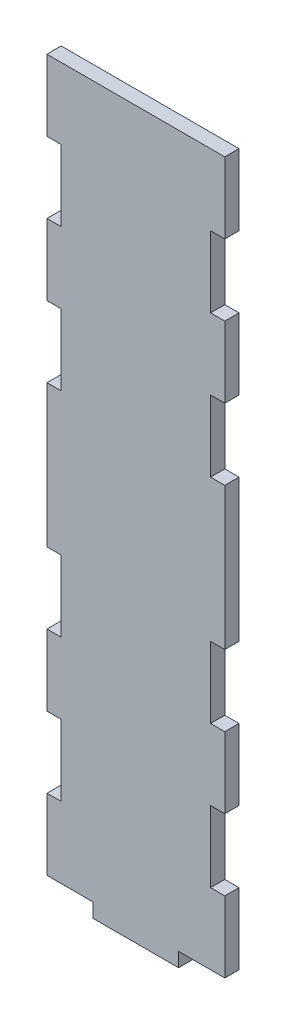
ISO-10303-21;
HEADER;
FILE_DESCRIPTION(('STEP AP214'),'2;1');
FILE_NAME('part.step','',(''),(''),'','','');
FILE_SCHEMA(('AUTOMOTIVE_DESIGN { 1 0 10303 214 1 1 1 1 }'));
ENDSEC;
DATA;
#1=APPLICATION_CONTEXT('core data for automotive mechanical design processes');
#2=APPLICATION_PROTOCOL_DEFINITION('international standard','automotive_design',2000,#1);
#3=PRODUCT_CONTEXT('',#1,'mechanical');
#4=PRODUCT('Part','Part','',(#3));
#5=PRODUCT_RELATED_PRODUCT_CATEGORY('part','',(#4));
#6=PRODUCT_DEFINITION_FORMATION('','',#4);
#7=PRODUCT_DEFINITION_CONTEXT('part definition',#1,'design');
#8=PRODUCT_DEFINITION('design','',#6,#7);
#9=PRODUCT_DEFINITION_SHAPE('','',#8);
#10=(LENGTH_UNIT() NAMED_UNIT(*) SI_UNIT(.MILLI.,.METRE.));
#11=(NAMED_UNIT(*) PLANE_ANGLE_UNIT() SI_UNIT($,.RADIAN.));
#12=(NAMED_UNIT(*) SI_UNIT($,.STERADIAN.) SOLID_ANGLE_UNIT());
#13=UNCERTAINTY_MEASURE_WITH_UNIT(LENGTH_MEASURE(1.E-05),#10,'distance_accuracy_value','');
#14=(GEOMETRIC_REPRESENTATION_CONTEXT(3) GLOBAL_UNCERTAINTY_ASSIGNED_CONTEXT((#13)) GLOBAL_UNIT_ASSIGNED_CONTEXT((#10,
#11,#12)) REPRESENTATION_CONTEXT('',''));
#15=CARTESIAN_POINT('',(0.,0.,0.));
#16=DIRECTION('',(0.,0.,1.));
#17=DIRECTION('',(1.,0.,0.));
#18=AXIS2_PLACEMENT_3D('',#15,#16,#17);
#19=CARTESIAN_POINT('',(50.,-100.,4.));
#20=DIRECTION('',(-1.,0.,0.));
#21=DIRECTION('',(0.,0.,1.));
#22=AXIS2_PLACEMENT_3D('',#19,#20,#21);
#23=PLANE('',#22);
#24=DIRECTION('',(0.,1.,0.));
#25=VECTOR('',#24,1.);
#26=CARTESIAN_POINT('',(50.,-100.,0.));
#27=LINE('',#26,#25);
#28=CARTESIAN_POINT('',(50.,40.,0.));
#29=VERTEX_POINT('',#28);
#30=CARTESIAN_POINT('',(50.,60.,0.));
#31=VERTEX_POINT('',#30);
#32=EDGE_CURVE('E391',#29,#31,#27,.T.);
#33=ORIENTED_EDGE('',*,*,#32,.T.);
#34=DIRECTION('',(0.,0.,1.));
#35=VECTOR('',#34,1.);
#36=CARTESIAN_POINT('',(50.,60.,0.));
#37=LINE('',#36,#35);
#38=CARTESIAN_POINT('',(50.,60.,4.));
#39=VERTEX_POINT('',#38);
#40=EDGE_CURVE('E584',#31,#39,#37,.T.);
#41=ORIENTED_EDGE('',*,*,#40,.T.);
#42=DIRECTION('',(0.,1.,0.));
#43=VECTOR('',#42,1.);
#44=CARTESIAN_POINT('',(50.,-100.,4.));
#45=LINE('',#44,#43);
#46=CARTESIAN_POINT('',(50.,40.,4.));
#47=VERTEX_POINT('',#46);
#48=EDGE_CURVE('E647',#47,#39,#45,.T.);
#49=ORIENTED_EDGE('',*,*,#48,.F.);
#50=DIRECTION('',(0.,0.,1.));
#51=VECTOR('',#50,1.);
#52=CARTESIAN_POINT('',(50.,40.,0.));
#53=LINE('',#52,#51);
#54=EDGE_CURVE('E432',#29,#47,#53,.T.);
#55=ORIENTED_EDGE('',*,*,#54,.F.);
#56=EDGE_LOOP('',(#33,#41,#49,#55));
#57=FACE_BOUND('',#56,.T.);
#58=ADVANCED_FACE('F111',(#57),#23,.F.);
#59=CARTESIAN_POINT('',(50.,-20.,4.));
#60=VERTEX_POINT('',#59);
#61=CARTESIAN_POINT('',(50.,20.,4.));
#62=VERTEX_POINT('',#61);
#63=EDGE_CURVE('E650',#60,#62,#45,.T.);
#64=ORIENTED_EDGE('',*,*,#63,.F.);
#65=DIRECTION('',(0.,0.,1.));
#66=VECTOR('',#65,1.);
#67=CARTESIAN_POINT('',(50.,-20.,0.));
#68=LINE('',#67,#66);
#69=CARTESIAN_POINT('',(50.,-20.,0.));
#70=VERTEX_POINT('',#69);
#71=EDGE_CURVE('E423',#70,#60,#68,.T.);
#72=ORIENTED_EDGE('',*,*,#71,.F.);
#73=CARTESIAN_POINT('',(50.,20.,0.));
#74=VERTEX_POINT('',#73);
#75=EDGE_CURVE('E396',#70,#74,#27,.T.);
#76=ORIENTED_EDGE('',*,*,#75,.T.);
#77=DIRECTION('',(0.,0.,1.));
#78=VECTOR('',#77,1.);
#79=CARTESIAN_POINT('',(50.,20.,0.));
#80=LINE('',#79,#78);
#81=EDGE_CURVE('E421',#74,#62,#80,.T.);
#82=ORIENTED_EDGE('',*,*,#81,.T.);
#83=EDGE_LOOP('',(#64,#72,#76,#82));
#84=FACE_BOUND('',#83,.T.);
#85=ADVANCED_FACE('F420',(#84),#23,.F.);
#86=CARTESIAN_POINT('',(50.,-60.,0.));
#87=VERTEX_POINT('',#86);
#88=CARTESIAN_POINT('',(50.,-40.,0.));
#89=VERTEX_POINT('',#88);
#90=EDGE_CURVE('E403',#87,#89,#27,.T.);
#91=ORIENTED_EDGE('',*,*,#90,.T.);
#92=DIRECTION('',(0.,0.,1.));
#93=VECTOR('',#92,1.);
#94=CARTESIAN_POINT('',(50.,-40.,0.));
#95=LINE('',#94,#93);
#96=CARTESIAN_POINT('',(50.,-40.,4.));
#97=VERTEX_POINT('',#96);
#98=EDGE_CURVE('E665',#89,#97,#95,.T.);
#99=ORIENTED_EDGE('',*,*,#98,.T.);
#100=CARTESIAN_POINT('',(50.,-60.,4.));
#101=VERTEX_POINT('',#100);
#102=EDGE_CURVE('E596',#101,#97,#45,.T.);
#103=ORIENTED_EDGE('',*,*,#102,.F.);
#104=DIRECTION('',(0.,0.,1.));
#105=VECTOR('',#104,1.);
#106=CARTESIAN_POINT('',(50.,-60.,0.));
#107=LINE('',#106,#105);
#108=EDGE_CURVE('E449',#87,#101,#107,.T.);
#109=ORIENTED_EDGE('',*,*,#108,.F.);
#110=EDGE_LOOP('',(#91,#99,#103,#109));
#111=FACE_BOUND('',#110,.T.);
#112=ADVANCED_FACE('F664',(#111),#23,.F.);
#113=CARTESIAN_POINT('',(50.,-100.,0.));
#114=VERTEX_POINT('',#113);
#115=CARTESIAN_POINT('',(50.,-80.,0.));
#116=VERTEX_POINT('',#115);
#117=EDGE_CURVE('E394',#114,#116,#27,.T.);
#118=ORIENTED_EDGE('',*,*,#117,.T.);
#119=DIRECTION('',(0.,0.,1.));
#120=VECTOR('',#119,1.);
#121=CARTESIAN_POINT('',(50.,-80.,0.));
#122=LINE('',#121,#120);
#123=CARTESIAN_POINT('',(50.,-80.,4.));
#124=VERTEX_POINT('',#123);
#125=EDGE_CURVE('E447',#116,#124,#122,.T.);
#126=ORIENTED_EDGE('',*,*,#125,.T.);
#127=CARTESIAN_POINT('',(50.,-100.,4.));
#128=VERTEX_POINT('',#127);
#129=EDGE_CURVE('E592',#128,#124,#45,.T.);
#130=ORIENTED_EDGE('',*,*,#129,.F.);
#131=DIRECTION('',(0.,0.,-1.));
#132=VECTOR('',#131,1.);
#133=CARTESIAN_POINT('',(50.,-100.,4.));
#134=LINE('',#133,#132);
#135=EDGE_CURVE('E607',#128,#114,#134,.T.);
#136=ORIENTED_EDGE('',*,*,#135,.T.);
#137=EDGE_LOOP('',(#118,#126,#130,#136));
#138=FACE_BOUND('',#137,.T.);
#139=ADVANCED_FACE('F738',(#138),#23,.F.);
#140=CARTESIAN_POINT('',(50.,80.,4.));
#141=VERTEX_POINT('',#140);
#142=CARTESIAN_POINT('',(50.,100.,4.));
#143=VERTEX_POINT('',#142);
#144=EDGE_CURVE('E383',#141,#143,#45,.T.);
#145=ORIENTED_EDGE('',*,*,#144,.F.);
#146=DIRECTION('',(0.,0.,1.));
#147=VECTOR('',#146,1.);
#148=CARTESIAN_POINT('',(50.,80.,0.));
#149=LINE('',#148,#147);
#150=CARTESIAN_POINT('',(50.,80.,0.));
#151=VERTEX_POINT('',#150);
#152=EDGE_CURVE('E371',#151,#141,#149,.T.);
#153=ORIENTED_EDGE('',*,*,#152,.F.);
#154=CARTESIAN_POINT('',(50.,100.,0.));
#155=VERTEX_POINT('',#154);
#156=EDGE_CURVE('E381',#151,#155,#27,.T.);
#157=ORIENTED_EDGE('',*,*,#156,.T.);
#158=DIRECTION('',(0.,0.,-1.));
#159=VECTOR('',#158,1.);
#160=CARTESIAN_POINT('',(50.,100.,4.));
#161=LINE('',#160,#159);
#162=EDGE_CURVE('E12',#143,#155,#161,.T.);
#163=ORIENTED_EDGE('',*,*,#162,.F.);
#164=EDGE_LOOP('',(#145,#153,#157,#163));
#165=FACE_BOUND('',#164,.T.);
#166=ADVANCED_FACE('F113',(#165),#23,.F.);
#167=CARTESIAN_POINT('',(-50.,100.,4.));
#168=DIRECTION('',(0.,-1.,0.));
#169=DIRECTION('',(1.,0.,0.));
#170=AXIS2_PLACEMENT_3D('',#167,#168,#169);
#171=PLANE('',#170);
#172=DIRECTION('',(-1.,0.,0.));
#173=VECTOR('',#172,1.);
#174=CARTESIAN_POINT('',(-50.,100.,0.));
#175=LINE('',#174,#173);
#176=CARTESIAN_POINT('',(0.,100.,0.));
#177=VERTEX_POINT('',#176);
#178=EDGE_CURVE('E390',#155,#177,#175,.T.);
#179=ORIENTED_EDGE('',*,*,#178,.T.);
#180=DIRECTION('',(0.,0.,1.));
#181=VECTOR('',#180,1.);
#182=CARTESIAN_POINT('',(0.,100.,0.));
#183=LINE('',#182,#181);
#184=CARTESIAN_POINT('',(0.,100.,4.));
#185=VERTEX_POINT('',#184);
#186=EDGE_CURVE('E540',#177,#185,#183,.T.);
#187=ORIENTED_EDGE('',*,*,#186,.T.);
#188=DIRECTION('',(-1.,0.,0.));
#189=VECTOR('',#188,1.);
#190=CARTESIAN_POINT('',(-50.,100.,4.));
#191=LINE('',#190,#189);
#192=EDGE_CURVE('E595',#143,#185,#191,.T.);
#193=ORIENTED_EDGE('',*,*,#192,.F.);
#194=ORIENTED_EDGE('',*,*,#162,.T.);
#195=EDGE_LOOP('',(#179,#187,#193,#194));
#196=FACE_BOUND('',#195,.T.);
#197=ADVANCED_FACE('F737',(#196),#171,.F.);
#198=CARTESIAN_POINT('',(-13.,-100.,4.));
#199=DIRECTION('',(0.,1.,0.));
#200=DIRECTION('',(0.,0.,1.));
#201=AXIS2_PLACEMENT_3D('',#198,#199,#200);
#202=PLANE('',#201);
#203=DIRECTION('',(1.,0.,0.));
#204=VECTOR('',#203,1.);
#205=CARTESIAN_POINT('',(-13.,-100.,4.));
#206=LINE('',#205,#204);
#207=CARTESIAN_POINT('',(0.,-100.,4.));
#208=VERTEX_POINT('',#207);
#209=CARTESIAN_POINT('',(13.0000000000001,-100.,4.));
#210=VERTEX_POINT('',#209);
#211=EDGE_CURVE('E599',#208,#210,#206,.T.);
#212=ORIENTED_EDGE('',*,*,#211,.F.);
#213=DIRECTION('',(0.,0.,1.));
#214=VECTOR('',#213,1.);
#215=CARTESIAN_POINT('',(0.,-100.,0.));
#216=LINE('',#215,#214);
#217=CARTESIAN_POINT('',(0.,-100.,0.));
#218=VERTEX_POINT('',#217);
#219=EDGE_CURVE('E568',#218,#208,#216,.T.);
#220=ORIENTED_EDGE('',*,*,#219,.F.);
#221=DIRECTION('',(1.,0.,0.));
#222=VECTOR('',#221,1.);
#223=CARTESIAN_POINT('',(-13.,-100.,0.));
#224=LINE('',#223,#222);
#225=CARTESIAN_POINT('',(13.0000000000001,-100.,0.));
#226=VERTEX_POINT('',#225);
#227=EDGE_CURVE('E408',#218,#226,#224,.T.);
#228=ORIENTED_EDGE('',*,*,#227,.T.);
#229=DIRECTION('',(0.,0.,-1.));
#230=VECTOR('',#229,1.);
#231=CARTESIAN_POINT('',(13.0000000000001,-100.,4.));
#232=LINE('',#231,#230);
#233=EDGE_CURVE('E119',#210,#226,#232,.T.);
#234=ORIENTED_EDGE('',*,*,#233,.F.);
#235=EDGE_LOOP('',(#212,#220,#228,#234));
#236=FACE_BOUND('',#235,.T.);
#237=ADVANCED_FACE('F744',(#236),#202,.F.);
#238=CARTESIAN_POINT('',(13.0000000000001,-104.,4.));
#239=DIRECTION('',(1.,0.,0.));
#240=DIRECTION('',(0.,0.,-1.));
#241=AXIS2_PLACEMENT_3D('',#238,#239,#240);
#242=PLANE('',#241);
#243=DIRECTION('',(0.,-1.,0.));
#244=VECTOR('',#243,1.);
#245=CARTESIAN_POINT('',(13.0000000000001,-104.,0.));
#246=LINE('',#245,#244);
#247=CARTESIAN_POINT('',(13.0000000000001,-104.,0.));
#248=VERTEX_POINT('',#247);
#249=EDGE_CURVE('E632',#226,#248,#246,.T.);
#250=ORIENTED_EDGE('',*,*,#249,.T.);
#251=DIRECTION('',(0.,0.,-1.));
#252=VECTOR('',#251,1.);
#253=CARTESIAN_POINT('',(13.0000000000001,-104.,4.));
#254=LINE('',#253,#252);
#255=CARTESIAN_POINT('',(13.0000000000001,-104.,4.));
#256=VERTEX_POINT('',#255);
#257=EDGE_CURVE('E623',#256,#248,#254,.T.);
#258=ORIENTED_EDGE('',*,*,#257,.F.);
#259=DIRECTION('',(0.,-1.,0.));
#260=VECTOR('',#259,1.);
#261=CARTESIAN_POINT('',(13.0000000000001,-104.,4.));
#262=LINE('',#261,#260);
#263=EDGE_CURVE('E601',#210,#256,#262,.T.);
#264=ORIENTED_EDGE('',*,*,#263,.F.);
#265=ORIENTED_EDGE('',*,*,#233,.T.);
#266=EDGE_LOOP('',(#250,#258,#264,#265));
#267=FACE_BOUND('',#266,.T.);
#268=ADVANCED_FACE('F630',(#267),#242,.F.);
#269=CARTESIAN_POINT('',(37.0000000000001,-104.,4.));
#270=DIRECTION('',(0.,1.,0.));
#271=DIRECTION('',(-1.,0.,0.));
#272=AXIS2_PLACEMENT_3D('',#269,#270,#271);
#273=PLANE('',#272);
#274=DIRECTION('',(1.,0.,0.));
#275=VECTOR('',#274,1.);
#276=CARTESIAN_POINT('',(37.0000000000001,-104.,0.));
#277=LINE('',#276,#275);
#278=CARTESIAN_POINT('',(37.0000000000001,-104.,0.));
#279=VERTEX_POINT('',#278);
#280=EDGE_CURVE('E638',#248,#279,#277,.T.);
#281=ORIENTED_EDGE('',*,*,#280,.T.);
#282=DIRECTION('',(0.,0.,-1.));
#283=VECTOR('',#282,1.);
#284=CARTESIAN_POINT('',(37.0000000000001,-104.,4.));
#285=LINE('',#284,#283);
#286=CARTESIAN_POINT('',(37.0000000000001,-104.,4.));
#287=VERTEX_POINT('',#286);
#288=EDGE_CURVE('E615',#287,#279,#285,.T.);
#289=ORIENTED_EDGE('',*,*,#288,.F.);
#290=DIRECTION('',(1.,0.,0.));
#291=VECTOR('',#290,1.);
#292=CARTESIAN_POINT('',(37.0000000000001,-104.,4.));
#293=LINE('',#292,#291);
#294=EDGE_CURVE('E603',#256,#287,#293,.T.);
#295=ORIENTED_EDGE('',*,*,#294,.F.);
#296=ORIENTED_EDGE('',*,*,#257,.T.);
#297=EDGE_LOOP('',(#281,#289,#295,#296));
#298=FACE_BOUND('',#297,.T.);
#299=ADVANCED_FACE('F933',(#298),#273,.F.);
#300=CARTESIAN_POINT('',(37.0000000000001,-100.,4.));
#301=DIRECTION('',(-1.,0.,0.));
#302=DIRECTION('',(0.,-1.,0.));
#303=AXIS2_PLACEMENT_3D('',#300,#301,#302);
#304=PLANE('',#303);
#305=DIRECTION('',(0.,1.,0.));
#306=VECTOR('',#305,1.);
#307=CARTESIAN_POINT('',(37.0000000000001,-100.,0.));
#308=LINE('',#307,#306);
#309=CARTESIAN_POINT('',(37.0000000000001,-100.,0.));
#310=VERTEX_POINT('',#309);
#311=EDGE_CURVE('E640',#279,#310,#308,.T.);
#312=ORIENTED_EDGE('',*,*,#311,.T.);
#313=DIRECTION('',(0.,0.,-1.));
#314=VECTOR('',#313,1.);
#315=CARTESIAN_POINT('',(37.0000000000001,-100.,4.));
#316=LINE('',#315,#314);
#317=CARTESIAN_POINT('',(37.0000000000001,-100.,4.));
#318=VERTEX_POINT('',#317);
#319=EDGE_CURVE('E611',#318,#310,#316,.T.);
#320=ORIENTED_EDGE('',*,*,#319,.F.);
#321=DIRECTION('',(0.,1.,0.));
#322=VECTOR('',#321,1.);
#323=CARTESIAN_POINT('',(37.0000000000001,-100.,4.));
#324=LINE('',#323,#322);
#325=EDGE_CURVE('E605',#287,#318,#324,.T.);
#326=ORIENTED_EDGE('',*,*,#325,.F.);
#327=ORIENTED_EDGE('',*,*,#288,.T.);
#328=EDGE_LOOP('',(#312,#320,#326,#327));
#329=FACE_BOUND('',#328,.T.);
#330=ADVANCED_FACE('F930',(#329),#304,.F.);
#331=CARTESIAN_POINT('',(37.0000000000001,-100.,4.));
#332=DIRECTION('',(0.,1.,0.));
#333=DIRECTION('',(-1.,0.,0.));
#334=AXIS2_PLACEMENT_3D('',#331,#332,#333);
#335=PLANE('',#334);
#336=DIRECTION('',(1.,0.,0.));
#337=VECTOR('',#336,1.);
#338=CARTESIAN_POINT('',(37.0000000000001,-100.,0.));
#339=LINE('',#338,#337);
#340=EDGE_CURVE('E618',#310,#114,#339,.T.);
#341=ORIENTED_EDGE('',*,*,#340,.T.);
#342=ORIENTED_EDGE('',*,*,#135,.F.);
#343=DIRECTION('',(1.,0.,0.));
#344=VECTOR('',#343,1.);
#345=CARTESIAN_POINT('',(37.0000000000001,-100.,4.));
#346=LINE('',#345,#344);
#347=EDGE_CURVE('E606',#318,#128,#346,.T.);
#348=ORIENTED_EDGE('',*,*,#347,.F.);
#349=ORIENTED_EDGE('',*,*,#319,.T.);
#350=EDGE_LOOP('',(#341,#342,#348,#349));
#351=FACE_BOUND('',#350,.T.);
#352=ADVANCED_FACE('F925',(#351),#335,.F.);
#353=CARTESIAN_POINT('',(0.,0.,4.));
#354=DIRECTION('',(0.,0.,-1.));
#355=DIRECTION('',(-1.,0.,0.));
#356=AXIS2_PLACEMENT_3D('',#353,#354,#355);
#357=PLANE('',#356);
#358=ORIENTED_EDGE('',*,*,#48,.T.);
#359=DIRECTION('',(1.,0.,0.));
#360=VECTOR('',#359,1.);
#361=CARTESIAN_POINT('',(46.,60.,4.));
#362=LINE('',#361,#360);
#363=CARTESIAN_POINT('',(46.,60.,4.));
#364=VERTEX_POINT('',#363);
#365=EDGE_CURVE('E376',#364,#39,#362,.T.);
#366=ORIENTED_EDGE('',*,*,#365,.F.);
#367=DIRECTION('',(0.,-1.,0.));
#368=VECTOR('',#367,1.);
#369=CARTESIAN_POINT('',(46.,80.,4.));
#370=LINE('',#369,#368);
#371=CARTESIAN_POINT('',(46.,80.,4.));
#372=VERTEX_POINT('',#371);
#373=EDGE_CURVE('E697',#372,#364,#370,.T.);
#374=ORIENTED_EDGE('',*,*,#373,.F.);
#375=DIRECTION('',(-1.,0.,0.));
#376=VECTOR('',#375,1.);
#377=CARTESIAN_POINT('',(50.,80.,4.));
#378=LINE('',#377,#376);
#379=EDGE_CURVE('E695',#141,#372,#378,.T.);
#380=ORIENTED_EDGE('',*,*,#379,.F.);
#381=ORIENTED_EDGE('',*,*,#144,.T.);
#382=ORIENTED_EDGE('',*,*,#192,.T.);
#383=DIRECTION('',(0.,1.,0.));
#384=VECTOR('',#383,1.);
#385=CARTESIAN_POINT('',(0.,0.,4.));
#386=LINE('',#385,#384);
#387=CARTESIAN_POINT('',(0.,80.,4.));
#388=VERTEX_POINT('',#387);
#389=EDGE_CURVE('E474',#388,#185,#386,.T.);
#390=ORIENTED_EDGE('',*,*,#389,.F.);
#391=DIRECTION('',(1.,0.,0.));
#392=VECTOR('',#391,1.);
#393=CARTESIAN_POINT('',(0.,80.,4.));
#394=LINE('',#393,#392);
#395=CARTESIAN_POINT('',(4.,80.,4.));
#396=VERTEX_POINT('',#395);
#397=EDGE_CURVE('E537',#388,#396,#394,.T.);
#398=ORIENTED_EDGE('',*,*,#397,.T.);
#399=DIRECTION('',(0.,-1.,0.));
#400=VECTOR('',#399,1.);
#401=CARTESIAN_POINT('',(4.00000000000001,0.,4.));
#402=LINE('',#401,#400);
#403=CARTESIAN_POINT('',(4.,60.,4.));
#404=VERTEX_POINT('',#403);
#405=EDGE_CURVE('E534',#396,#404,#402,.T.);
#406=ORIENTED_EDGE('',*,*,#405,.T.);
#407=DIRECTION('',(-1.,0.,0.));
#408=VECTOR('',#407,1.);
#409=CARTESIAN_POINT('',(0.,60.,4.));
#410=LINE('',#409,#408);
#411=CARTESIAN_POINT('',(0.,60.,4.));
#412=VERTEX_POINT('',#411);
#413=EDGE_CURVE('E531',#404,#412,#410,.T.);
#414=ORIENTED_EDGE('',*,*,#413,.T.);
#415=CARTESIAN_POINT('',(0.,40.,4.));
#416=VERTEX_POINT('',#415);
#417=EDGE_CURVE('E527',#416,#412,#386,.T.);
#418=ORIENTED_EDGE('',*,*,#417,.F.);
#419=DIRECTION('',(1.,0.,0.));
#420=VECTOR('',#419,1.);
#421=CARTESIAN_POINT('',(0.,40.,4.));
#422=LINE('',#421,#420);
#423=CARTESIAN_POINT('',(4.00000000000001,40.,4.));
#424=VERTEX_POINT('',#423);
#425=EDGE_CURVE('E580',#416,#424,#422,.T.);
#426=ORIENTED_EDGE('',*,*,#425,.T.);
#427=DIRECTION('',(0.,-1.,0.));
#428=VECTOR('',#427,1.);
#429=CARTESIAN_POINT('',(4.00000000000001,40.,4.));
#430=LINE('',#429,#428);
#431=CARTESIAN_POINT('',(4.00000000000001,20.,4.));
#432=VERTEX_POINT('',#431);
#433=EDGE_CURVE('E583',#424,#432,#430,.T.);
#434=ORIENTED_EDGE('',*,*,#433,.T.);
#435=DIRECTION('',(-1.,0.,0.));
#436=VECTOR('',#435,1.);
#437=CARTESIAN_POINT('',(4.00000000000001,20.,4.));
#438=LINE('',#437,#436);
#439=CARTESIAN_POINT('',(0.,20.,4.));
#440=VERTEX_POINT('',#439);
#441=EDGE_CURVE('E574',#432,#440,#438,.T.);
#442=ORIENTED_EDGE('',*,*,#441,.T.);
#443=CARTESIAN_POINT('',(0.,-20.,4.));
#444=VERTEX_POINT('',#443);
#445=EDGE_CURVE('E528',#444,#440,#386,.T.);
#446=ORIENTED_EDGE('',*,*,#445,.F.);
#447=DIRECTION('',(-1.,0.,0.));
#448=VECTOR('',#447,1.);
#449=CARTESIAN_POINT('',(0.,-20.,4.));
#450=LINE('',#449,#448);
#451=CARTESIAN_POINT('',(4.00000000000001,-20.,4.));
#452=VERTEX_POINT('',#451);
#453=EDGE_CURVE('E524',#452,#444,#450,.T.);
#454=ORIENTED_EDGE('',*,*,#453,.F.);
#455=DIRECTION('',(0.,1.,0.));
#456=VECTOR('',#455,1.);
#457=CARTESIAN_POINT('',(4.,0.,4.));
#458=LINE('',#457,#456);
#459=CARTESIAN_POINT('',(4.00000000000002,-40.,4.));
#460=VERTEX_POINT('',#459);
#461=EDGE_CURVE('E521',#460,#452,#458,.T.);
#462=ORIENTED_EDGE('',*,*,#461,.F.);
#463=DIRECTION('',(1.,0.,0.));
#464=VECTOR('',#463,1.);
#465=CARTESIAN_POINT('',(0.,-40.,4.));
#466=LINE('',#465,#464);
#467=CARTESIAN_POINT('',(0.,-40.,4.));
#468=VERTEX_POINT('',#467);
#469=EDGE_CURVE('E518',#468,#460,#466,.T.);
#470=ORIENTED_EDGE('',*,*,#469,.F.);
#471=DIRECTION('',(0.,1.,0.));
#472=VECTOR('',#471,1.);
#473=CARTESIAN_POINT('',(0.,0.,4.));
#474=LINE('',#473,#472);
#475=CARTESIAN_POINT('',(0.,-60.,4.));
#476=VERTEX_POINT('',#475);
#477=EDGE_CURVE('E509',#476,#468,#474,.T.);
#478=ORIENTED_EDGE('',*,*,#477,.F.);
#479=DIRECTION('',(-1.,0.,0.));
#480=VECTOR('',#479,1.);
#481=CARTESIAN_POINT('',(0.,-60.,4.));
#482=LINE('',#481,#480);
#483=CARTESIAN_POINT('',(4.00000000000002,-60.,4.));
#484=VERTEX_POINT('',#483);
#485=EDGE_CURVE('E515',#484,#476,#482,.T.);
#486=ORIENTED_EDGE('',*,*,#485,.F.);
#487=DIRECTION('',(0.,1.,0.));
#488=VECTOR('',#487,1.);
#489=CARTESIAN_POINT('',(3.99999999999998,0.,4.));
#490=LINE('',#489,#488);
#491=CARTESIAN_POINT('',(4.00000000000003,-80.,4.));
#492=VERTEX_POINT('',#491);
#493=EDGE_CURVE('E512',#492,#484,#490,.T.);
#494=ORIENTED_EDGE('',*,*,#493,.F.);
#495=DIRECTION('',(1.,0.,0.));
#496=VECTOR('',#495,1.);
#497=CARTESIAN_POINT('',(0.,-80.,4.));
#498=LINE('',#497,#496);
#499=CARTESIAN_POINT('',(0.,-80.,4.));
#500=VERTEX_POINT('',#499);
#501=EDGE_CURVE('E507',#500,#492,#498,.T.);
#502=ORIENTED_EDGE('',*,*,#501,.F.);
#503=EDGE_CURVE('E504',#208,#500,#474,.T.);
#504=ORIENTED_EDGE('',*,*,#503,.F.);
#505=ORIENTED_EDGE('',*,*,#211,.T.);
#506=ORIENTED_EDGE('',*,*,#263,.T.);
#507=ORIENTED_EDGE('',*,*,#294,.T.);
#508=ORIENTED_EDGE('',*,*,#325,.T.);
#509=ORIENTED_EDGE('',*,*,#347,.T.);
#510=ORIENTED_EDGE('',*,*,#129,.T.);
#511=DIRECTION('',(1.,0.,0.));
#512=VECTOR('',#511,1.);
#513=CARTESIAN_POINT('',(50.,-80.,4.));
#514=LINE('',#513,#512);
#515=CARTESIAN_POINT('',(46.,-80.,4.));
#516=VERTEX_POINT('',#515);
#517=EDGE_CURVE('E457',#516,#124,#514,.T.);
#518=ORIENTED_EDGE('',*,*,#517,.F.);
#519=DIRECTION('',(0.,-1.,0.));
#520=VECTOR('',#519,1.);
#521=CARTESIAN_POINT('',(46.,-80.,4.));
#522=LINE('',#521,#520);
#523=CARTESIAN_POINT('',(46.,-60.,4.));
#524=VERTEX_POINT('',#523);
#525=EDGE_CURVE('E460',#524,#516,#522,.T.);
#526=ORIENTED_EDGE('',*,*,#525,.F.);
#527=DIRECTION('',(-1.,0.,0.));
#528=VECTOR('',#527,1.);
#529=CARTESIAN_POINT('',(46.,-60.,4.));
#530=LINE('',#529,#528);
#531=EDGE_CURVE('E454',#101,#524,#530,.T.);
#532=ORIENTED_EDGE('',*,*,#531,.F.);
#533=ORIENTED_EDGE('',*,*,#102,.T.);
#534=DIRECTION('',(1.,0.,0.));
#535=VECTOR('',#534,1.);
#536=CARTESIAN_POINT('',(50.,-40.,4.));
#537=LINE('',#536,#535);
#538=CARTESIAN_POINT('',(46.,-40.,4.));
#539=VERTEX_POINT('',#538);
#540=EDGE_CURVE('E662',#539,#97,#537,.T.);
#541=ORIENTED_EDGE('',*,*,#540,.F.);
#542=DIRECTION('',(0.,-1.,0.));
#543=VECTOR('',#542,1.);
#544=CARTESIAN_POINT('',(46.,-40.,4.));
#545=LINE('',#544,#543);
#546=CARTESIAN_POINT('',(46.,-20.,4.));
#547=VERTEX_POINT('',#546);
#548=EDGE_CURVE('E453',#547,#539,#545,.T.);
#549=ORIENTED_EDGE('',*,*,#548,.F.);
#550=DIRECTION('',(-1.,0.,0.));
#551=VECTOR('',#550,1.);
#552=CARTESIAN_POINT('',(46.,-20.,4.));
#553=LINE('',#552,#551);
#554=EDGE_CURVE('E676',#60,#547,#553,.T.);
#555=ORIENTED_EDGE('',*,*,#554,.F.);
#556=ORIENTED_EDGE('',*,*,#63,.T.);
#557=DIRECTION('',(1.,0.,0.));
#558=VECTOR('',#557,1.);
#559=CARTESIAN_POINT('',(46.,20.,4.));
#560=LINE('',#559,#558);
#561=CARTESIAN_POINT('',(46.,20.,4.));
#562=VERTEX_POINT('',#561);
#563=EDGE_CURVE('E443',#562,#62,#560,.T.);
#564=ORIENTED_EDGE('',*,*,#563,.F.);
#565=DIRECTION('',(0.,-1.,0.));
#566=VECTOR('',#565,1.);
#567=CARTESIAN_POINT('',(46.,40.,4.));
#568=LINE('',#567,#566);
#569=CARTESIAN_POINT('',(46.,40.,4.));
#570=VERTEX_POINT('',#569);
#571=EDGE_CURVE('E691',#570,#562,#568,.T.);
#572=ORIENTED_EDGE('',*,*,#571,.F.);
#573=DIRECTION('',(-1.,0.,0.));
#574=VECTOR('',#573,1.);
#575=CARTESIAN_POINT('',(50.,40.,4.));
#576=LINE('',#575,#574);
#577=EDGE_CURVE('E439',#47,#570,#576,.T.);
#578=ORIENTED_EDGE('',*,*,#577,.F.);
#579=EDGE_LOOP('',(#358,#366,#374,#380,#381,#382,#390,#398,#406,#414,#418,#426,#434,#442,#446,
#454,#462,#470,#478,#486,#494,#502,#504,#505,#506,#507,#508,#509,#510,#518,#526,#532,#533,#541,
#549,#555,#556,#564,#572,#578));
#580=FACE_BOUND('',#579,.T.);
#581=ADVANCED_FACE('F660',(#580),#357,.F.);
#582=CARTESIAN_POINT('',(0.,0.,0.));
#583=DIRECTION('',(0.,0.,-1.));
#584=DIRECTION('',(-1.,0.,0.));
#585=AXIS2_PLACEMENT_3D('',#582,#583,#584);
#586=PLANE('',#585);
#587=DIRECTION('',(1.,0.,0.));
#588=VECTOR('',#587,1.);
#589=CARTESIAN_POINT('',(46.,60.,0.));
#590=LINE('',#589,#588);
#591=CARTESIAN_POINT('',(46.,60.,0.));
#592=VERTEX_POINT('',#591);
#593=EDGE_CURVE('E384',#592,#31,#590,.T.);
#594=ORIENTED_EDGE('',*,*,#593,.T.);
#595=ORIENTED_EDGE('',*,*,#32,.F.);
#596=DIRECTION('',(-1.,0.,0.));
#597=VECTOR('',#596,1.);
#598=CARTESIAN_POINT('',(50.,40.,0.));
#599=LINE('',#598,#597);
#600=CARTESIAN_POINT('',(46.,40.,0.));
#601=VERTEX_POINT('',#600);
#602=EDGE_CURVE('E434',#29,#601,#599,.T.);
#603=ORIENTED_EDGE('',*,*,#602,.T.);
#604=DIRECTION('',(0.,-1.,0.));
#605=VECTOR('',#604,1.);
#606=CARTESIAN_POINT('',(46.,40.,0.));
#607=LINE('',#606,#605);
#608=CARTESIAN_POINT('',(46.,20.,0.));
#609=VERTEX_POINT('',#608);
#610=EDGE_CURVE('E134',#601,#609,#607,.T.);
#611=ORIENTED_EDGE('',*,*,#610,.T.);
#612=DIRECTION('',(1.,0.,0.));
#613=VECTOR('',#612,1.);
#614=CARTESIAN_POINT('',(46.,20.,0.));
#615=LINE('',#614,#613);
#616=EDGE_CURVE('E429',#609,#74,#615,.T.);
#617=ORIENTED_EDGE('',*,*,#616,.T.);
#618=ORIENTED_EDGE('',*,*,#75,.F.);
#619=DIRECTION('',(-1.,0.,0.));
#620=VECTOR('',#619,1.);
#621=CARTESIAN_POINT('',(46.,-20.,0.));
#622=LINE('',#621,#620);
#623=CARTESIAN_POINT('',(46.,-20.,0.));
#624=VERTEX_POINT('',#623);
#625=EDGE_CURVE('E427',#70,#624,#622,.T.);
#626=ORIENTED_EDGE('',*,*,#625,.T.);
#627=DIRECTION('',(0.,-1.,0.));
#628=VECTOR('',#627,1.);
#629=CARTESIAN_POINT('',(46.,-40.,0.));
#630=LINE('',#629,#628);
#631=CARTESIAN_POINT('',(46.,-40.,0.));
#632=VERTEX_POINT('',#631);
#633=EDGE_CURVE('E679',#624,#632,#630,.T.);
#634=ORIENTED_EDGE('',*,*,#633,.T.);
#635=DIRECTION('',(1.,0.,0.));
#636=VECTOR('',#635,1.);
#637=CARTESIAN_POINT('',(50.,-40.,0.));
#638=LINE('',#637,#636);
#639=EDGE_CURVE('E684',#632,#89,#638,.T.);
#640=ORIENTED_EDGE('',*,*,#639,.T.);
#641=ORIENTED_EDGE('',*,*,#90,.F.);
#642=DIRECTION('',(-1.,0.,0.));
#643=VECTOR('',#642,1.);
#644=CARTESIAN_POINT('',(46.,-60.,0.));
#645=LINE('',#644,#643);
#646=CARTESIAN_POINT('',(46.,-60.,0.));
#647=VERTEX_POINT('',#646);
#648=EDGE_CURVE('E446',#87,#647,#645,.T.);
#649=ORIENTED_EDGE('',*,*,#648,.T.);
#650=DIRECTION('',(0.,-1.,0.));
#651=VECTOR('',#650,1.);
#652=CARTESIAN_POINT('',(46.,-80.,0.));
#653=LINE('',#652,#651);
#654=CARTESIAN_POINT('',(46.,-80.,0.));
#655=VERTEX_POINT('',#654);
#656=EDGE_CURVE('E458',#647,#655,#653,.T.);
#657=ORIENTED_EDGE('',*,*,#656,.T.);
#658=DIRECTION('',(1.,0.,0.));
#659=VECTOR('',#658,1.);
#660=CARTESIAN_POINT('',(50.,-80.,0.));
#661=LINE('',#660,#659);
#662=EDGE_CURVE('E465',#655,#116,#661,.T.);
#663=ORIENTED_EDGE('',*,*,#662,.T.);
#664=ORIENTED_EDGE('',*,*,#117,.F.);
#665=ORIENTED_EDGE('',*,*,#340,.F.);
#666=ORIENTED_EDGE('',*,*,#311,.F.);
#667=ORIENTED_EDGE('',*,*,#280,.F.);
#668=ORIENTED_EDGE('',*,*,#249,.F.);
#669=ORIENTED_EDGE('',*,*,#227,.F.);
#670=DIRECTION('',(0.,1.,0.));
#671=VECTOR('',#670,1.);
#672=CARTESIAN_POINT('',(0.,0.,0.));
#673=LINE('',#672,#671);
#674=CARTESIAN_POINT('',(0.,-80.,0.));
#675=VERTEX_POINT('',#674);
#676=EDGE_CURVE('E470',#218,#675,#673,.T.);
#677=ORIENTED_EDGE('',*,*,#676,.T.);
#678=DIRECTION('',(1.,0.,0.));
#679=VECTOR('',#678,1.);
#680=CARTESIAN_POINT('',(0.,-80.,0.));
#681=LINE('',#680,#679);
#682=CARTESIAN_POINT('',(4.00000000000003,-80.,0.));
#683=VERTEX_POINT('',#682);
#684=EDGE_CURVE('E473',#675,#683,#681,.T.);
#685=ORIENTED_EDGE('',*,*,#684,.T.);
#686=DIRECTION('',(0.,1.,0.));
#687=VECTOR('',#686,1.);
#688=CARTESIAN_POINT('',(3.99999999999998,0.,0.));
#689=LINE('',#688,#687);
#690=CARTESIAN_POINT('',(4.00000000000002,-60.,0.));
#691=VERTEX_POINT('',#690);
#692=EDGE_CURVE('E478',#683,#691,#689,.T.);
#693=ORIENTED_EDGE('',*,*,#692,.T.);
#694=DIRECTION('',(-1.,0.,0.));
#695=VECTOR('',#694,1.);
#696=CARTESIAN_POINT('',(0.,-60.,0.));
#697=LINE('',#696,#695);
#698=CARTESIAN_POINT('',(0.,-60.,0.));
#699=VERTEX_POINT('',#698);
#700=EDGE_CURVE('E481',#691,#699,#697,.T.);
#701=ORIENTED_EDGE('',*,*,#700,.T.);
#702=CARTESIAN_POINT('',(0.,-40.,0.));
#703=VERTEX_POINT('',#702);
#704=EDGE_CURVE('E475',#699,#703,#673,.T.);
#705=ORIENTED_EDGE('',*,*,#704,.T.);
#706=DIRECTION('',(1.,0.,0.));
#707=VECTOR('',#706,1.);
#708=CARTESIAN_POINT('',(0.,-40.,0.));
#709=LINE('',#708,#707);
#710=CARTESIAN_POINT('',(4.00000000000002,-40.,0.));
#711=VERTEX_POINT('',#710);
#712=EDGE_CURVE('E484',#703,#711,#709,.T.);
#713=ORIENTED_EDGE('',*,*,#712,.T.);
#714=DIRECTION('',(0.,1.,0.));
#715=VECTOR('',#714,1.);
#716=CARTESIAN_POINT('',(4.,0.,0.));
#717=LINE('',#716,#715);
#718=CARTESIAN_POINT('',(4.00000000000001,-20.,0.));
#719=VERTEX_POINT('',#718);
#720=EDGE_CURVE('E487',#711,#719,#717,.T.);
#721=ORIENTED_EDGE('',*,*,#720,.T.);
#722=DIRECTION('',(-1.,0.,0.));
#723=VECTOR('',#722,1.);
#724=CARTESIAN_POINT('',(0.,-20.,0.));
#725=LINE('',#724,#723);
#726=CARTESIAN_POINT('',(0.,-20.,0.));
#727=VERTEX_POINT('',#726);
#728=EDGE_CURVE('E490',#719,#727,#725,.T.);
#729=ORIENTED_EDGE('',*,*,#728,.T.);
#730=DIRECTION('',(0.,1.,0.));
#731=VECTOR('',#730,1.);
#732=CARTESIAN_POINT('',(0.,0.,0.));
#733=LINE('',#732,#731);
#734=CARTESIAN_POINT('',(0.,20.,0.));
#735=VERTEX_POINT('',#734);
#736=EDGE_CURVE('E494',#727,#735,#733,.T.);
#737=ORIENTED_EDGE('',*,*,#736,.T.);
#738=DIRECTION('',(-1.,0.,0.));
#739=VECTOR('',#738,1.);
#740=CARTESIAN_POINT('',(4.00000000000001,20.,0.));
#741=LINE('',#740,#739);
#742=CARTESIAN_POINT('',(4.00000000000001,20.,0.));
#743=VERTEX_POINT('',#742);
#744=EDGE_CURVE('E576',#743,#735,#741,.T.);
#745=ORIENTED_EDGE('',*,*,#744,.F.);
#746=DIRECTION('',(0.,-1.,0.));
#747=VECTOR('',#746,1.);
#748=CARTESIAN_POINT('',(4.00000000000001,40.,0.));
#749=LINE('',#748,#747);
#750=CARTESIAN_POINT('',(4.00000000000001,40.,0.));
#751=VERTEX_POINT('',#750);
#752=EDGE_CURVE('E573',#751,#743,#749,.T.);
#753=ORIENTED_EDGE('',*,*,#752,.F.);
#754=DIRECTION('',(1.,0.,0.));
#755=VECTOR('',#754,1.);
#756=CARTESIAN_POINT('',(0.,40.,0.));
#757=LINE('',#756,#755);
#758=CARTESIAN_POINT('',(0.,40.,0.));
#759=VERTEX_POINT('',#758);
#760=EDGE_CURVE('E571',#759,#751,#757,.T.);
#761=ORIENTED_EDGE('',*,*,#760,.F.);
#762=CARTESIAN_POINT('',(0.,60.,0.));
#763=VERTEX_POINT('',#762);
#764=EDGE_CURVE('E493',#759,#763,#733,.T.);
#765=ORIENTED_EDGE('',*,*,#764,.T.);
#766=DIRECTION('',(-1.,0.,0.));
#767=VECTOR('',#766,1.);
#768=CARTESIAN_POINT('',(0.,60.,0.));
#769=LINE('',#768,#767);
#770=CARTESIAN_POINT('',(4.,60.,0.));
#771=VERTEX_POINT('',#770);
#772=EDGE_CURVE('E497',#771,#763,#769,.T.);
#773=ORIENTED_EDGE('',*,*,#772,.F.);
#774=DIRECTION('',(0.,-1.,0.));
#775=VECTOR('',#774,1.);
#776=CARTESIAN_POINT('',(4.00000000000001,0.,0.));
#777=LINE('',#776,#775);
#778=CARTESIAN_POINT('',(4.,80.,0.));
#779=VERTEX_POINT('',#778);
#780=EDGE_CURVE('E500',#779,#771,#777,.T.);
#781=ORIENTED_EDGE('',*,*,#780,.F.);
#782=DIRECTION('',(1.,0.,0.));
#783=VECTOR('',#782,1.);
#784=CARTESIAN_POINT('',(0.,80.,0.));
#785=LINE('',#784,#783);
#786=CARTESIAN_POINT('',(0.,80.,0.));
#787=VERTEX_POINT('',#786);
#788=EDGE_CURVE('E502',#787,#779,#785,.T.);
#789=ORIENTED_EDGE('',*,*,#788,.F.);
#790=EDGE_CURVE('E498',#787,#177,#733,.T.);
#791=ORIENTED_EDGE('',*,*,#790,.T.);
#792=ORIENTED_EDGE('',*,*,#178,.F.);
#793=ORIENTED_EDGE('',*,*,#156,.F.);
#794=DIRECTION('',(-1.,0.,0.));
#795=VECTOR('',#794,1.);
#796=CARTESIAN_POINT('',(50.,80.,0.));
#797=LINE('',#796,#795);
#798=CARTESIAN_POINT('',(46.,80.,0.));
#799=VERTEX_POINT('',#798);
#800=EDGE_CURVE('E367',#151,#799,#797,.T.);
#801=ORIENTED_EDGE('',*,*,#800,.T.);
#802=DIRECTION('',(0.,-1.,0.));
#803=VECTOR('',#802,1.);
#804=CARTESIAN_POINT('',(46.,80.,0.));
#805=LINE('',#804,#803);
#806=EDGE_CURVE('E126',#799,#592,#805,.T.);
#807=ORIENTED_EDGE('',*,*,#806,.T.);
#808=EDGE_LOOP('',(#594,#595,#603,#611,#617,#618,#626,#634,#640,#641,#649,#657,#663,#664,#665,
#666,#667,#668,#669,#677,#685,#693,#701,#705,#713,#721,#729,#737,#745,#753,#761,#765,#773,#781,
#789,#791,#792,#793,#801,#807));
#809=FACE_BOUND('',#808,.T.);
#810=ADVANCED_FACE('F387',(#809),#586,.T.);
#811=CARTESIAN_POINT('',(0.,0.,0.));
#812=DIRECTION('',(1.,0.,0.));
#813=DIRECTION('',(0.,1.,0.));
#814=AXIS2_PLACEMENT_3D('',#811,#812,#813);
#815=PLANE('',#814);
#816=ORIENTED_EDGE('',*,*,#389,.T.);
#817=ORIENTED_EDGE('',*,*,#186,.F.);
#818=ORIENTED_EDGE('',*,*,#790,.F.);
#819=DIRECTION('',(0.,0.,1.));
#820=VECTOR('',#819,1.);
#821=CARTESIAN_POINT('',(0.,80.,0.));
#822=LINE('',#821,#820);
#823=EDGE_CURVE('E543',#787,#388,#822,.T.);
#824=ORIENTED_EDGE('',*,*,#823,.T.);
#825=EDGE_LOOP('',(#816,#817,#818,#824));
#826=FACE_BOUND('',#825,.T.);
#827=ADVANCED_FACE('F868',(#826),#815,.F.);
#828=CARTESIAN_POINT('',(0.,80.,0.));
#829=DIRECTION('',(0.,-1.,0.));
#830=DIRECTION('',(0.,0.,-1.));
#831=AXIS2_PLACEMENT_3D('',#828,#829,#830);
#832=PLANE('',#831);
#833=ORIENTED_EDGE('',*,*,#397,.F.);
#834=ORIENTED_EDGE('',*,*,#823,.F.);
#835=ORIENTED_EDGE('',*,*,#788,.T.);
#836=DIRECTION('',(0.,0.,1.));
#837=VECTOR('',#836,1.);
#838=CARTESIAN_POINT('',(4.,80.,0.));
#839=LINE('',#838,#837);
#840=EDGE_CURVE('E545',#779,#396,#839,.T.);
#841=ORIENTED_EDGE('',*,*,#840,.T.);
#842=EDGE_LOOP('',(#833,#834,#835,#841));
#843=FACE_BOUND('',#842,.T.);
#844=ADVANCED_FACE('F871',(#843),#832,.T.);
#845=CARTESIAN_POINT('',(4.00000000000001,0.,0.));
#846=DIRECTION('',(-1.,0.,0.));
#847=DIRECTION('',(0.,-1.,0.));
#848=AXIS2_PLACEMENT_3D('',#845,#846,#847);
#849=PLANE('',#848);
#850=ORIENTED_EDGE('',*,*,#405,.F.);
#851=ORIENTED_EDGE('',*,*,#840,.F.);
#852=ORIENTED_EDGE('',*,*,#780,.T.);
#853=DIRECTION('',(0.,0.,1.));
#854=VECTOR('',#853,1.);
#855=CARTESIAN_POINT('',(4.,60.,0.));
#856=LINE('',#855,#854);
#857=EDGE_CURVE('E547',#771,#404,#856,.T.);
#858=ORIENTED_EDGE('',*,*,#857,.T.);
#859=EDGE_LOOP('',(#850,#851,#852,#858));
#860=FACE_BOUND('',#859,.T.);
#861=ADVANCED_FACE('F877',(#860),#849,.T.);
#862=CARTESIAN_POINT('',(0.,60.,0.));
#863=DIRECTION('',(0.,1.,0.));
#864=DIRECTION('',(0.,0.,1.));
#865=AXIS2_PLACEMENT_3D('',#862,#863,#864);
#866=PLANE('',#865);
#867=ORIENTED_EDGE('',*,*,#413,.F.);
#868=ORIENTED_EDGE('',*,*,#857,.F.);
#869=ORIENTED_EDGE('',*,*,#772,.T.);
#870=DIRECTION('',(0.,0.,1.));
#871=VECTOR('',#870,1.);
#872=CARTESIAN_POINT('',(0.,60.,0.));
#873=LINE('',#872,#871);
#874=EDGE_CURVE('E549',#763,#412,#873,.T.);
#875=ORIENTED_EDGE('',*,*,#874,.T.);
#876=EDGE_LOOP('',(#867,#868,#869,#875));
#877=FACE_BOUND('',#876,.T.);
#878=ADVANCED_FACE('F881',(#877),#866,.T.);
#879=ORIENTED_EDGE('',*,*,#417,.T.);
#880=ORIENTED_EDGE('',*,*,#874,.F.);
#881=ORIENTED_EDGE('',*,*,#764,.F.);
#882=DIRECTION('',(0.,0.,-1.));
#883=VECTOR('',#882,1.);
#884=CARTESIAN_POINT('',(0.,40.,0.));
#885=LINE('',#884,#883);
#886=EDGE_CURVE('E392',#416,#759,#885,.T.);
#887=ORIENTED_EDGE('',*,*,#886,.F.);
#888=EDGE_LOOP('',(#879,#880,#881,#887));
#889=FACE_BOUND('',#888,.T.);
#890=ADVANCED_FACE('F873',(#889),#815,.F.);
#891=ORIENTED_EDGE('',*,*,#736,.F.);
#892=DIRECTION('',(0.,0.,1.));
#893=VECTOR('',#892,1.);
#894=CARTESIAN_POINT('',(0.,-20.,0.));
#895=LINE('',#894,#893);
#896=EDGE_CURVE('E552',#727,#444,#895,.T.);
#897=ORIENTED_EDGE('',*,*,#896,.T.);
#898=ORIENTED_EDGE('',*,*,#445,.T.);
#899=DIRECTION('',(0.,0.,1.));
#900=VECTOR('',#899,1.);
#901=CARTESIAN_POINT('',(0.,20.,0.));
#902=LINE('',#901,#900);
#903=EDGE_CURVE('E398',#735,#440,#902,.T.);
#904=ORIENTED_EDGE('',*,*,#903,.F.);
#905=EDGE_LOOP('',(#891,#897,#898,#904));
#906=FACE_BOUND('',#905,.T.);
#907=ADVANCED_FACE('F874',(#906),#815,.F.);
#908=CARTESIAN_POINT('',(0.,-20.,0.));
#909=DIRECTION('',(0.,1.,0.));
#910=DIRECTION('',(0.,0.,1.));
#911=AXIS2_PLACEMENT_3D('',#908,#909,#910);
#912=PLANE('',#911);
#913=ORIENTED_EDGE('',*,*,#453,.T.);
#914=ORIENTED_EDGE('',*,*,#896,.F.);
#915=ORIENTED_EDGE('',*,*,#728,.F.);
#916=DIRECTION('',(0.,0.,1.));
#917=VECTOR('',#916,1.);
#918=CARTESIAN_POINT('',(4.00000000000001,-20.,0.));
#919=LINE('',#918,#917);
#920=EDGE_CURVE('E554',#719,#452,#919,.T.);
#921=ORIENTED_EDGE('',*,*,#920,.T.);
#922=EDGE_LOOP('',(#913,#914,#915,#921));
#923=FACE_BOUND('',#922,.T.);
#924=ADVANCED_FACE('F886',(#923),#912,.F.);
#925=CARTESIAN_POINT('',(4.,0.,0.));
#926=DIRECTION('',(1.,0.,0.));
#927=DIRECTION('',(0.,1.,0.));
#928=AXIS2_PLACEMENT_3D('',#925,#926,#927);
#929=PLANE('',#928);
#930=ORIENTED_EDGE('',*,*,#461,.T.);
#931=ORIENTED_EDGE('',*,*,#920,.F.);
#932=ORIENTED_EDGE('',*,*,#720,.F.);
#933=DIRECTION('',(0.,0.,1.));
#934=VECTOR('',#933,1.);
#935=CARTESIAN_POINT('',(4.00000000000002,-40.,0.));
#936=LINE('',#935,#934);
#937=EDGE_CURVE('E556',#711,#460,#936,.T.);
#938=ORIENTED_EDGE('',*,*,#937,.T.);
#939=EDGE_LOOP('',(#930,#931,#932,#938));
#940=FACE_BOUND('',#939,.T.);
#941=ADVANCED_FACE('F889',(#940),#929,.F.);
#942=CARTESIAN_POINT('',(0.,-40.,0.));
#943=DIRECTION('',(0.,-1.,0.));
#944=DIRECTION('',(0.,0.,-1.));
#945=AXIS2_PLACEMENT_3D('',#942,#943,#944);
#946=PLANE('',#945);
#947=ORIENTED_EDGE('',*,*,#469,.T.);
#948=ORIENTED_EDGE('',*,*,#937,.F.);
#949=ORIENTED_EDGE('',*,*,#712,.F.);
#950=DIRECTION('',(0.,0.,1.));
#951=VECTOR('',#950,1.);
#952=CARTESIAN_POINT('',(0.,-40.,0.));
#953=LINE('',#952,#951);
#954=EDGE_CURVE('E558',#703,#468,#953,.T.);
#955=ORIENTED_EDGE('',*,*,#954,.T.);
#956=EDGE_LOOP('',(#947,#948,#949,#955));
#957=FACE_BOUND('',#956,.T.);
#958=ADVANCED_FACE('F893',(#957),#946,.F.);
#959=CARTESIAN_POINT('',(0.,0.,0.));
#960=DIRECTION('',(1.,0.,0.));
#961=DIRECTION('',(0.,1.,0.));
#962=AXIS2_PLACEMENT_3D('',#959,#960,#961);
#963=PLANE('',#962);
#964=ORIENTED_EDGE('',*,*,#477,.T.);
#965=ORIENTED_EDGE('',*,*,#954,.F.);
#966=ORIENTED_EDGE('',*,*,#704,.F.);
#967=DIRECTION('',(0.,0.,1.));
#968=VECTOR('',#967,1.);
#969=CARTESIAN_POINT('',(0.,-60.,0.));
#970=LINE('',#969,#968);
#971=EDGE_CURVE('E560',#699,#476,#970,.T.);
#972=ORIENTED_EDGE('',*,*,#971,.T.);
#973=EDGE_LOOP('',(#964,#965,#966,#972));
#974=FACE_BOUND('',#973,.T.);
#975=ADVANCED_FACE('F897',(#974),#963,.F.);
#976=CARTESIAN_POINT('',(0.,-60.,0.));
#977=DIRECTION('',(0.,1.,0.));
#978=DIRECTION('',(0.,0.,1.));
#979=AXIS2_PLACEMENT_3D('',#976,#977,#978);
#980=PLANE('',#979);
#981=ORIENTED_EDGE('',*,*,#485,.T.);
#982=ORIENTED_EDGE('',*,*,#971,.F.);
#983=ORIENTED_EDGE('',*,*,#700,.F.);
#984=DIRECTION('',(0.,0.,1.));
#985=VECTOR('',#984,1.);
#986=CARTESIAN_POINT('',(4.00000000000002,-60.,0.));
#987=LINE('',#986,#985);
#988=EDGE_CURVE('E562',#691,#484,#987,.T.);
#989=ORIENTED_EDGE('',*,*,#988,.T.);
#990=EDGE_LOOP('',(#981,#982,#983,#989));
#991=FACE_BOUND('',#990,.T.);
#992=ADVANCED_FACE('F901',(#991),#980,.F.);
#993=CARTESIAN_POINT('',(3.99999999999998,0.,0.));
#994=DIRECTION('',(1.,0.,0.));
#995=DIRECTION('',(0.,1.,0.));
#996=AXIS2_PLACEMENT_3D('',#993,#994,#995);
#997=PLANE('',#996);
#998=ORIENTED_EDGE('',*,*,#493,.T.);
#999=ORIENTED_EDGE('',*,*,#988,.F.);
#1000=ORIENTED_EDGE('',*,*,#692,.F.);
#1001=DIRECTION('',(0.,0.,1.));
#1002=VECTOR('',#1001,1.);
#1003=CARTESIAN_POINT('',(4.00000000000003,-80.,0.));
#1004=LINE('',#1003,#1002);
#1005=EDGE_CURVE('E564',#683,#492,#1004,.T.);
#1006=ORIENTED_EDGE('',*,*,#1005,.T.);
#1007=EDGE_LOOP('',(#998,#999,#1000,#1006));
#1008=FACE_BOUND('',#1007,.T.);
#1009=ADVANCED_FACE('F906',(#1008),#997,.F.);
#1010=CARTESIAN_POINT('',(0.,-80.,0.));
#1011=DIRECTION('',(0.,-1.,0.));
#1012=DIRECTION('',(0.,0.,-1.));
#1013=AXIS2_PLACEMENT_3D('',#1010,#1011,#1012);
#1014=PLANE('',#1013);
#1015=ORIENTED_EDGE('',*,*,#501,.T.);
#1016=ORIENTED_EDGE('',*,*,#1005,.F.);
#1017=ORIENTED_EDGE('',*,*,#684,.F.);
#1018=DIRECTION('',(0.,0.,1.));
#1019=VECTOR('',#1018,1.);
#1020=CARTESIAN_POINT('',(0.,-80.,0.));
#1021=LINE('',#1020,#1019);
#1022=EDGE_CURVE('E566',#675,#500,#1021,.T.);
#1023=ORIENTED_EDGE('',*,*,#1022,.T.);
#1024=EDGE_LOOP('',(#1015,#1016,#1017,#1023));
#1025=FACE_BOUND('',#1024,.T.);
#1026=ADVANCED_FACE('F910',(#1025),#1014,.F.);
#1027=ORIENTED_EDGE('',*,*,#503,.T.);
#1028=ORIENTED_EDGE('',*,*,#1022,.F.);
#1029=ORIENTED_EDGE('',*,*,#676,.F.);
#1030=ORIENTED_EDGE('',*,*,#219,.T.);
#1031=EDGE_LOOP('',(#1027,#1028,#1029,#1030));
#1032=FACE_BOUND('',#1031,.T.);
#1033=ADVANCED_FACE('F903',(#1032),#963,.F.);
#1034=CARTESIAN_POINT('',(4.00000000000001,40.,0.));
#1035=DIRECTION('',(-1.,0.,0.));
#1036=DIRECTION('',(0.,-1.,0.));
#1037=AXIS2_PLACEMENT_3D('',#1034,#1035,#1036);
#1038=PLANE('',#1037);
#1039=ORIENTED_EDGE('',*,*,#433,.F.);
#1040=DIRECTION('',(0.,0.,1.));
#1041=VECTOR('',#1040,1.);
#1042=CARTESIAN_POINT('',(4.00000000000001,40.,0.));
#1043=LINE('',#1042,#1041);
#1044=EDGE_CURVE('E508',#751,#424,#1043,.T.);
#1045=ORIENTED_EDGE('',*,*,#1044,.F.);
#1046=ORIENTED_EDGE('',*,*,#752,.T.);
#1047=DIRECTION('',(0.,0.,1.));
#1048=VECTOR('',#1047,1.);
#1049=CARTESIAN_POINT('',(4.00000000000001,20.,0.));
#1050=LINE('',#1049,#1048);
#1051=EDGE_CURVE('E579',#743,#432,#1050,.T.);
#1052=ORIENTED_EDGE('',*,*,#1051,.T.);
#1053=EDGE_LOOP('',(#1039,#1045,#1046,#1052));
#1054=FACE_BOUND('',#1053,.T.);
#1055=ADVANCED_FACE('F917',(#1054),#1038,.T.);
#1056=CARTESIAN_POINT('',(4.00000000000001,20.,0.));
#1057=DIRECTION('',(0.,1.,0.));
#1058=DIRECTION('',(0.,0.,1.));
#1059=AXIS2_PLACEMENT_3D('',#1056,#1057,#1058);
#1060=PLANE('',#1059);
#1061=ORIENTED_EDGE('',*,*,#441,.F.);
#1062=ORIENTED_EDGE('',*,*,#1051,.F.);
#1063=ORIENTED_EDGE('',*,*,#744,.T.);
#1064=ORIENTED_EDGE('',*,*,#903,.T.);
#1065=EDGE_LOOP('',(#1061,#1062,#1063,#1064));
#1066=FACE_BOUND('',#1065,.T.);
#1067=ADVANCED_FACE('F730',(#1066),#1060,.T.);
#1068=CARTESIAN_POINT('',(0.,40.,0.));
#1069=DIRECTION('',(0.,-1.,0.));
#1070=DIRECTION('',(0.,0.,-1.));
#1071=AXIS2_PLACEMENT_3D('',#1068,#1069,#1070);
#1072=PLANE('',#1071);
#1073=ORIENTED_EDGE('',*,*,#425,.F.);
#1074=ORIENTED_EDGE('',*,*,#886,.T.);
#1075=ORIENTED_EDGE('',*,*,#760,.T.);
#1076=ORIENTED_EDGE('',*,*,#1044,.T.);
#1077=EDGE_LOOP('',(#1073,#1074,#1075,#1076));
#1078=FACE_BOUND('',#1077,.T.);
#1079=ADVANCED_FACE('F728',(#1078),#1072,.T.);
#1080=CARTESIAN_POINT('',(46.,20.,0.));
#1081=DIRECTION('',(0.,-1.,0.));
#1082=DIRECTION('',(0.,0.,-1.));
#1083=AXIS2_PLACEMENT_3D('',#1080,#1081,#1082);
#1084=PLANE('',#1083);
#1085=ORIENTED_EDGE('',*,*,#563,.T.);
#1086=ORIENTED_EDGE('',*,*,#81,.F.);
#1087=ORIENTED_EDGE('',*,*,#616,.F.);
#1088=DIRECTION('',(0.,0.,1.));
#1089=VECTOR('',#1088,1.);
#1090=CARTESIAN_POINT('',(46.,20.,0.));
#1091=LINE('',#1090,#1089);
#1092=EDGE_CURVE('E688',#609,#562,#1091,.T.);
#1093=ORIENTED_EDGE('',*,*,#1092,.T.);
#1094=EDGE_LOOP('',(#1085,#1086,#1087,#1093));
#1095=FACE_BOUND('',#1094,.T.);
#1096=ADVANCED_FACE('F720',(#1095),#1084,.F.);
#1097=CARTESIAN_POINT('',(46.,40.,0.));
#1098=DIRECTION('',(-1.,0.,0.));
#1099=DIRECTION('',(0.,0.,1.));
#1100=AXIS2_PLACEMENT_3D('',#1097,#1098,#1099);
#1101=PLANE('',#1100);
#1102=ORIENTED_EDGE('',*,*,#571,.T.);
#1103=ORIENTED_EDGE('',*,*,#1092,.F.);
#1104=ORIENTED_EDGE('',*,*,#610,.F.);
#1105=DIRECTION('',(0.,0.,1.));
#1106=VECTOR('',#1105,1.);
#1107=CARTESIAN_POINT('',(46.,40.,0.));
#1108=LINE('',#1107,#1106);
#1109=EDGE_CURVE('E436',#601,#570,#1108,.T.);
#1110=ORIENTED_EDGE('',*,*,#1109,.T.);
#1111=EDGE_LOOP('',(#1102,#1103,#1104,#1110));
#1112=FACE_BOUND('',#1111,.T.);
#1113=ADVANCED_FACE('F718',(#1112),#1101,.F.);
#1114=CARTESIAN_POINT('',(50.,40.,0.));
#1115=DIRECTION('',(0.,1.,0.));
#1116=DIRECTION('',(0.,0.,1.));
#1117=AXIS2_PLACEMENT_3D('',#1114,#1115,#1116);
#1118=PLANE('',#1117);
#1119=ORIENTED_EDGE('',*,*,#577,.T.);
#1120=ORIENTED_EDGE('',*,*,#1109,.F.);
#1121=ORIENTED_EDGE('',*,*,#602,.F.);
#1122=ORIENTED_EDGE('',*,*,#54,.T.);
#1123=EDGE_LOOP('',(#1119,#1120,#1121,#1122));
#1124=FACE_BOUND('',#1123,.T.);
#1125=ADVANCED_FACE('F717',(#1124),#1118,.F.);
#1126=CARTESIAN_POINT('',(46.,-80.,0.));
#1127=DIRECTION('',(-1.,0.,0.));
#1128=DIRECTION('',(0.,0.,1.));
#1129=AXIS2_PLACEMENT_3D('',#1126,#1127,#1128);
#1130=PLANE('',#1129);
#1131=ORIENTED_EDGE('',*,*,#525,.T.);
#1132=DIRECTION('',(0.,0.,1.));
#1133=VECTOR('',#1132,1.);
#1134=CARTESIAN_POINT('',(46.,-80.,0.));
#1135=LINE('',#1134,#1133);
#1136=EDGE_CURVE('E444',#655,#516,#1135,.T.);
#1137=ORIENTED_EDGE('',*,*,#1136,.F.);
#1138=ORIENTED_EDGE('',*,*,#656,.F.);
#1139=DIRECTION('',(0.,0.,1.));
#1140=VECTOR('',#1139,1.);
#1141=CARTESIAN_POINT('',(46.,-60.,0.));
#1142=LINE('',#1141,#1140);
#1143=EDGE_CURVE('E451',#647,#524,#1142,.T.);
#1144=ORIENTED_EDGE('',*,*,#1143,.T.);
#1145=EDGE_LOOP('',(#1131,#1137,#1138,#1144));
#1146=FACE_BOUND('',#1145,.T.);
#1147=ADVANCED_FACE('F726',(#1146),#1130,.F.);
#1148=CARTESIAN_POINT('',(46.,-60.,0.));
#1149=DIRECTION('',(0.,1.,0.));
#1150=DIRECTION('',(0.,0.,1.));
#1151=AXIS2_PLACEMENT_3D('',#1148,#1149,#1150);
#1152=PLANE('',#1151);
#1153=ORIENTED_EDGE('',*,*,#531,.T.);
#1154=ORIENTED_EDGE('',*,*,#1143,.F.);
#1155=ORIENTED_EDGE('',*,*,#648,.F.);
#1156=ORIENTED_EDGE('',*,*,#108,.T.);
#1157=EDGE_LOOP('',(#1153,#1154,#1155,#1156));
#1158=FACE_BOUND('',#1157,.T.);
#1159=ADVANCED_FACE('F785',(#1158),#1152,.F.);
#1160=CARTESIAN_POINT('',(50.,-80.,0.));
#1161=DIRECTION('',(0.,-1.,0.));
#1162=DIRECTION('',(1.,0.,0.));
#1163=AXIS2_PLACEMENT_3D('',#1160,#1161,#1162);
#1164=PLANE('',#1163);
#1165=ORIENTED_EDGE('',*,*,#517,.T.);
#1166=ORIENTED_EDGE('',*,*,#125,.F.);
#1167=ORIENTED_EDGE('',*,*,#662,.F.);
#1168=ORIENTED_EDGE('',*,*,#1136,.T.);
#1169=EDGE_LOOP('',(#1165,#1166,#1167,#1168));
#1170=FACE_BOUND('',#1169,.T.);
#1171=ADVANCED_FACE('F794',(#1170),#1164,.F.);
#1172=CARTESIAN_POINT('',(46.,-40.,0.));
#1173=DIRECTION('',(-1.,0.,0.));
#1174=DIRECTION('',(0.,0.,1.));
#1175=AXIS2_PLACEMENT_3D('',#1172,#1173,#1174);
#1176=PLANE('',#1175);
#1177=ORIENTED_EDGE('',*,*,#548,.T.);
#1178=DIRECTION('',(0.,0.,1.));
#1179=VECTOR('',#1178,1.);
#1180=CARTESIAN_POINT('',(46.,-40.,0.));
#1181=LINE('',#1180,#1179);
#1182=EDGE_CURVE('E669',#632,#539,#1181,.T.);
#1183=ORIENTED_EDGE('',*,*,#1182,.F.);
#1184=ORIENTED_EDGE('',*,*,#633,.F.);
#1185=DIRECTION('',(0.,0.,1.));
#1186=VECTOR('',#1185,1.);
#1187=CARTESIAN_POINT('',(46.,-20.,0.));
#1188=LINE('',#1187,#1186);
#1189=EDGE_CURVE('E672',#624,#547,#1188,.T.);
#1190=ORIENTED_EDGE('',*,*,#1189,.T.);
#1191=EDGE_LOOP('',(#1177,#1183,#1184,#1190));
#1192=FACE_BOUND('',#1191,.T.);
#1193=ADVANCED_FACE('F803',(#1192),#1176,.F.);
#1194=CARTESIAN_POINT('',(46.,-20.,0.));
#1195=DIRECTION('',(0.,1.,0.));
#1196=DIRECTION('',(0.,0.,1.));
#1197=AXIS2_PLACEMENT_3D('',#1194,#1195,#1196);
#1198=PLANE('',#1197);
#1199=ORIENTED_EDGE('',*,*,#554,.T.);
#1200=ORIENTED_EDGE('',*,*,#1189,.F.);
#1201=ORIENTED_EDGE('',*,*,#625,.F.);
#1202=ORIENTED_EDGE('',*,*,#71,.T.);
#1203=EDGE_LOOP('',(#1199,#1200,#1201,#1202));
#1204=FACE_BOUND('',#1203,.T.);
#1205=ADVANCED_FACE('F812',(#1204),#1198,.F.);
#1206=CARTESIAN_POINT('',(50.,-40.,0.));
#1207=DIRECTION('',(0.,-1.,0.));
#1208=DIRECTION('',(0.,0.,-1.));
#1209=AXIS2_PLACEMENT_3D('',#1206,#1207,#1208);
#1210=PLANE('',#1209);
#1211=ORIENTED_EDGE('',*,*,#540,.T.);
#1212=ORIENTED_EDGE('',*,*,#98,.F.);
#1213=ORIENTED_EDGE('',*,*,#639,.F.);
#1214=ORIENTED_EDGE('',*,*,#1182,.T.);
#1215=EDGE_LOOP('',(#1211,#1212,#1213,#1214));
#1216=FACE_BOUND('',#1215,.T.);
#1217=ADVANCED_FACE('F821',(#1216),#1210,.F.);
#1218=CARTESIAN_POINT('',(46.,60.,0.));
#1219=DIRECTION('',(0.,-1.,0.));
#1220=DIRECTION('',(0.,0.,-1.));
#1221=AXIS2_PLACEMENT_3D('',#1218,#1219,#1220);
#1222=PLANE('',#1221);
#1223=ORIENTED_EDGE('',*,*,#365,.T.);
#1224=ORIENTED_EDGE('',*,*,#40,.F.);
#1225=ORIENTED_EDGE('',*,*,#593,.F.);
#1226=DIRECTION('',(0.,0.,1.));
#1227=VECTOR('',#1226,1.);
#1228=CARTESIAN_POINT('',(46.,60.,0.));
#1229=LINE('',#1228,#1227);
#1230=EDGE_CURVE('E708',#592,#364,#1229,.T.);
#1231=ORIENTED_EDGE('',*,*,#1230,.T.);
#1232=EDGE_LOOP('',(#1223,#1224,#1225,#1231));
#1233=FACE_BOUND('',#1232,.T.);
#1234=ADVANCED_FACE('F713',(#1233),#1222,.F.);
#1235=CARTESIAN_POINT('',(46.,80.,0.));
#1236=DIRECTION('',(-1.,0.,0.));
#1237=DIRECTION('',(0.,0.,1.));
#1238=AXIS2_PLACEMENT_3D('',#1235,#1236,#1237);
#1239=PLANE('',#1238);
#1240=ORIENTED_EDGE('',*,*,#373,.T.);
#1241=ORIENTED_EDGE('',*,*,#1230,.F.);
#1242=ORIENTED_EDGE('',*,*,#806,.F.);
#1243=DIRECTION('',(0.,0.,1.));
#1244=VECTOR('',#1243,1.);
#1245=CARTESIAN_POINT('',(46.,80.,0.));
#1246=LINE('',#1245,#1244);
#1247=EDGE_CURVE('E373',#799,#372,#1246,.T.);
#1248=ORIENTED_EDGE('',*,*,#1247,.T.);
#1249=EDGE_LOOP('',(#1240,#1241,#1242,#1248));
#1250=FACE_BOUND('',#1249,.T.);
#1251=ADVANCED_FACE('F710',(#1250),#1239,.F.);
#1252=CARTESIAN_POINT('',(50.,80.,0.));
#1253=DIRECTION('',(0.,1.,0.));
#1254=DIRECTION('',(-1.,0.,0.));
#1255=AXIS2_PLACEMENT_3D('',#1252,#1253,#1254);
#1256=PLANE('',#1255);
#1257=ORIENTED_EDGE('',*,*,#379,.T.);
#1258=ORIENTED_EDGE('',*,*,#1247,.F.);
#1259=ORIENTED_EDGE('',*,*,#800,.F.);
#1260=ORIENTED_EDGE('',*,*,#152,.T.);
#1261=EDGE_LOOP('',(#1257,#1258,#1259,#1260));
#1262=FACE_BOUND('',#1261,.T.);
#1263=ADVANCED_FACE('F370',(#1262),#1256,.F.);
#1264=CLOSED_SHELL('',(#58,#85,#112,#139,#166,#197,#237,#268,#299,#330,#352,#581,#810,#827,#844,
#861,#878,#890,#907,#924,#941,#958,#975,#992,#1009,#1026,#1033,#1055,#1067,#1079,#1096,#1113,
#1125,#1147,#1159,#1171,#1193,#1205,#1217,#1234,#1251,#1263));
#1265=MANIFOLD_SOLID_BREP('B2',#1264);
#1266=ADVANCED_BREP_SHAPE_REPRESENTATION('',(#18,#1265),#14);
#1267=SHAPE_DEFINITION_REPRESENTATION(#9,#1266);
ENDSEC;
END-ISO-10303-21;
